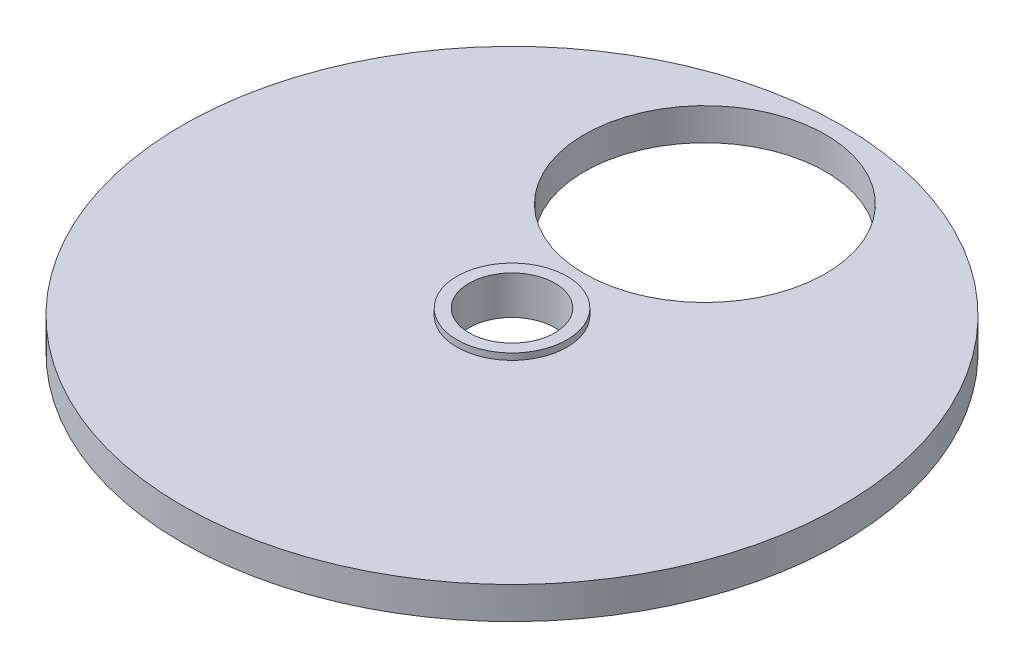
ISO-10303-21;
HEADER;
FILE_DESCRIPTION(('STEP AP214'),'2;1');
FILE_NAME('part.step','',(''),(''),'','','');
FILE_SCHEMA(('AUTOMOTIVE_DESIGN { 1 0 10303 214 1 1 1 1 }'));
ENDSEC;
DATA;
#1=APPLICATION_CONTEXT('core data for automotive mechanical design processes');
#2=APPLICATION_PROTOCOL_DEFINITION('international standard','automotive_design',2000,#1);
#3=PRODUCT_CONTEXT('',#1,'mechanical');
#4=PRODUCT('Part','Part','',(#3));
#5=PRODUCT_RELATED_PRODUCT_CATEGORY('part','',(#4));
#6=PRODUCT_DEFINITION_FORMATION('','',#4);
#7=PRODUCT_DEFINITION_CONTEXT('part definition',#1,'design');
#8=PRODUCT_DEFINITION('design','',#6,#7);
#9=PRODUCT_DEFINITION_SHAPE('','',#8);
#10=(LENGTH_UNIT() NAMED_UNIT(*) SI_UNIT(.MILLI.,.METRE.));
#11=(NAMED_UNIT(*) PLANE_ANGLE_UNIT() SI_UNIT($,.RADIAN.));
#12=(NAMED_UNIT(*) SI_UNIT($,.STERADIAN.) SOLID_ANGLE_UNIT());
#13=UNCERTAINTY_MEASURE_WITH_UNIT(LENGTH_MEASURE(1.E-05),#10,'distance_accuracy_value','');
#14=(GEOMETRIC_REPRESENTATION_CONTEXT(3) GLOBAL_UNCERTAINTY_ASSIGNED_CONTEXT((#13)) GLOBAL_UNIT_ASSIGNED_CONTEXT((#10,
#11,#12)) REPRESENTATION_CONTEXT('',''));
#15=CARTESIAN_POINT('',(0.,0.,0.));
#16=DIRECTION('',(0.,0.,1.));
#17=DIRECTION('',(1.,0.,0.));
#18=AXIS2_PLACEMENT_3D('',#15,#16,#17);
#19=CARTESIAN_POINT('',(0.,2.,0.));
#20=DIRECTION('',(0.,1.,0.));
#21=DIRECTION('',(0.,0.,1.));
#22=AXIS2_PLACEMENT_3D('',#19,#20,#21);
#23=PLANE('',#22);
#24=CARTESIAN_POINT('',(0.,2.,-12.));
#25=DIRECTION('',(0.,1.,0.));
#26=DIRECTION('',(0.,0.,1.));
#27=AXIS2_PLACEMENT_3D('',#24,#25,#26);
#28=CIRCLE('',#27,7.5);
#29=CARTESIAN_POINT('',(0.,2.,-4.5));
#30=VERTEX_POINT('',#29);
#31=EDGE_CURVE('E68',#30,#30,#28,.T.);
#32=ORIENTED_EDGE('',*,*,#31,.F.);
#33=EDGE_LOOP('',(#32));
#34=FACE_BOUND('',#33,.T.);
#35=CARTESIAN_POINT('',(0.,2.,0.));
#36=DIRECTION('',(0.,1.,0.));
#37=DIRECTION('',(0.,0.,1.));
#38=AXIS2_PLACEMENT_3D('',#35,#36,#37);
#39=CIRCLE('',#38,20.5);
#40=CARTESIAN_POINT('',(0.,2.,20.5));
#41=VERTEX_POINT('',#40);
#42=EDGE_CURVE('E10',#41,#41,#39,.T.);
#43=ORIENTED_EDGE('',*,*,#42,.T.);
#44=EDGE_LOOP('',(#43));
#45=FACE_BOUND('',#44,.T.);
#46=CARTESIAN_POINT('',(0.,2.,0.));
#47=DIRECTION('',(0.,1.,0.));
#48=DIRECTION('',(0.,0.,1.));
#49=AXIS2_PLACEMENT_3D('',#46,#47,#48);
#50=CIRCLE('',#49,3.425);
#51=CARTESIAN_POINT('',(0.,2.,3.425));
#52=VERTEX_POINT('',#51);
#53=EDGE_CURVE('E56',#52,#52,#50,.T.);
#54=ORIENTED_EDGE('',*,*,#53,.F.);
#55=EDGE_LOOP('',(#54));
#56=FACE_BOUND('',#55,.T.);
#57=ADVANCED_FACE('F37',(#34,#45,#56),#23,.T.);
#58=CARTESIAN_POINT('',(0.,2.,0.));
#59=DIRECTION('',(0.,-1.,0.));
#60=DIRECTION('',(0.,0.,-1.));
#61=AXIS2_PLACEMENT_3D('',#58,#59,#60);
#62=CYLINDRICAL_SURFACE('',#61,20.5);
#63=ORIENTED_EDGE('',*,*,#42,.F.);
#64=EDGE_LOOP('',(#63));
#65=FACE_BOUND('',#64,.T.);
#66=CARTESIAN_POINT('',(0.,0.,0.));
#67=DIRECTION('',(0.,1.,0.));
#68=DIRECTION('',(0.,0.,1.));
#69=AXIS2_PLACEMENT_3D('',#66,#67,#68);
#70=CIRCLE('',#69,20.5);
#71=CARTESIAN_POINT('',(0.,0.,20.5));
#72=VERTEX_POINT('',#71);
#73=EDGE_CURVE('E41',#72,#72,#70,.T.);
#74=ORIENTED_EDGE('',*,*,#73,.T.);
#75=EDGE_LOOP('',(#74));
#76=FACE_BOUND('',#75,.T.);
#77=ADVANCED_FACE('F39',(#65,#76),#62,.T.);
#78=CARTESIAN_POINT('',(0.,0.,0.));
#79=DIRECTION('',(0.,1.,0.));
#80=DIRECTION('',(0.,0.,1.));
#81=AXIS2_PLACEMENT_3D('',#78,#79,#80);
#82=PLANE('',#81);
#83=CARTESIAN_POINT('',(0.,0.,-12.));
#84=DIRECTION('',(0.,1.,0.));
#85=DIRECTION('',(0.,0.,1.));
#86=AXIS2_PLACEMENT_3D('',#83,#84,#85);
#87=CIRCLE('',#86,7.5);
#88=CARTESIAN_POINT('',(0.,0.,-4.5));
#89=VERTEX_POINT('',#88);
#90=EDGE_CURVE('E67',#89,#89,#87,.T.);
#91=ORIENTED_EDGE('',*,*,#90,.T.);
#92=EDGE_LOOP('',(#91));
#93=FACE_BOUND('',#92,.T.);
#94=CARTESIAN_POINT('',(0.,0.,0.));
#95=DIRECTION('',(0.,1.,0.));
#96=DIRECTION('',(0.,0.,1.));
#97=AXIS2_PLACEMENT_3D('',#94,#95,#96);
#98=CIRCLE('',#97,2.675);
#99=CARTESIAN_POINT('',(0.,0.,2.675));
#100=VERTEX_POINT('',#99);
#101=EDGE_CURVE('E50',#100,#100,#98,.T.);
#102=ORIENTED_EDGE('',*,*,#101,.T.);
#103=EDGE_LOOP('',(#102));
#104=FACE_BOUND('',#103,.T.);
#105=ORIENTED_EDGE('',*,*,#73,.F.);
#106=EDGE_LOOP('',(#105));
#107=FACE_BOUND('',#106,.T.);
#108=ADVANCED_FACE('F76',(#93,#104,#107),#82,.F.);
#109=CARTESIAN_POINT('',(0.,0.,0.));
#110=DIRECTION('',(0.,1.,0.));
#111=DIRECTION('',(0.,0.,1.));
#112=AXIS2_PLACEMENT_3D('',#109,#110,#111);
#113=CYLINDRICAL_SURFACE('',#112,2.675);
#114=ORIENTED_EDGE('',*,*,#101,.F.);
#115=EDGE_LOOP('',(#114));
#116=FACE_BOUND('',#115,.T.);
#117=CARTESIAN_POINT('',(0.,2.4,0.));
#118=DIRECTION('',(0.,1.,0.));
#119=DIRECTION('',(0.,0.,1.));
#120=AXIS2_PLACEMENT_3D('',#117,#118,#119);
#121=CIRCLE('',#120,2.675);
#122=CARTESIAN_POINT('',(0.,2.4,2.675));
#123=VERTEX_POINT('',#122);
#124=EDGE_CURVE('E60',#123,#123,#121,.T.);
#125=ORIENTED_EDGE('',*,*,#124,.T.);
#126=EDGE_LOOP('',(#125));
#127=FACE_BOUND('',#126,.T.);
#128=ADVANCED_FACE('F98',(#116,#127),#113,.F.);
#129=CARTESIAN_POINT('',(0.,2.4,0.));
#130=DIRECTION('',(0.,1.,0.));
#131=DIRECTION('',(0.,0.,1.));
#132=AXIS2_PLACEMENT_3D('',#129,#130,#131);
#133=PLANE('',#132);
#134=CARTESIAN_POINT('',(0.,2.4,0.));
#135=DIRECTION('',(0.,1.,0.));
#136=DIRECTION('',(0.,0.,1.));
#137=AXIS2_PLACEMENT_3D('',#134,#135,#136);
#138=CIRCLE('',#137,3.425);
#139=CARTESIAN_POINT('',(0.,2.4,3.425));
#140=VERTEX_POINT('',#139);
#141=EDGE_CURVE('E55',#140,#140,#138,.T.);
#142=ORIENTED_EDGE('',*,*,#141,.T.);
#143=EDGE_LOOP('',(#142));
#144=FACE_BOUND('',#143,.T.);
#145=ORIENTED_EDGE('',*,*,#124,.F.);
#146=EDGE_LOOP('',(#145));
#147=FACE_BOUND('',#146,.T.);
#148=ADVANCED_FACE('F92',(#144,#147),#133,.T.);
#149=CARTESIAN_POINT('',(0.,2.4,0.));
#150=DIRECTION('',(0.,-1.,0.));
#151=DIRECTION('',(0.,0.,-1.));
#152=AXIS2_PLACEMENT_3D('',#149,#150,#151);
#153=CYLINDRICAL_SURFACE('',#152,3.425);
#154=ORIENTED_EDGE('',*,*,#141,.F.);
#155=EDGE_LOOP('',(#154));
#156=FACE_BOUND('',#155,.T.);
#157=ORIENTED_EDGE('',*,*,#53,.T.);
#158=EDGE_LOOP('',(#157));
#159=FACE_BOUND('',#158,.T.);
#160=ADVANCED_FACE('F82',(#156,#159),#153,.T.);
#161=CARTESIAN_POINT('',(0.,0.,-12.));
#162=DIRECTION('',(0.,1.,0.));
#163=DIRECTION('',(0.,0.,1.));
#164=AXIS2_PLACEMENT_3D('',#161,#162,#163);
#165=CYLINDRICAL_SURFACE('',#164,7.5);
#166=ORIENTED_EDGE('',*,*,#90,.F.);
#167=EDGE_LOOP('',(#166));
#168=FACE_BOUND('',#167,.T.);
#169=ORIENTED_EDGE('',*,*,#31,.T.);
#170=EDGE_LOOP('',(#169));
#171=FACE_BOUND('',#170,.T.);
#172=ADVANCED_FACE('F79',(#168,#171),#165,.F.);
#173=CLOSED_SHELL('',(#57,#77,#108,#128,#148,#160,#172));
#174=MANIFOLD_SOLID_BREP('B2',#173);
#175=ADVANCED_BREP_SHAPE_REPRESENTATION('',(#18,#174),#14);
#176=SHAPE_DEFINITION_REPRESENTATION(#9,#175);
ENDSEC;
END-ISO-10303-21;
